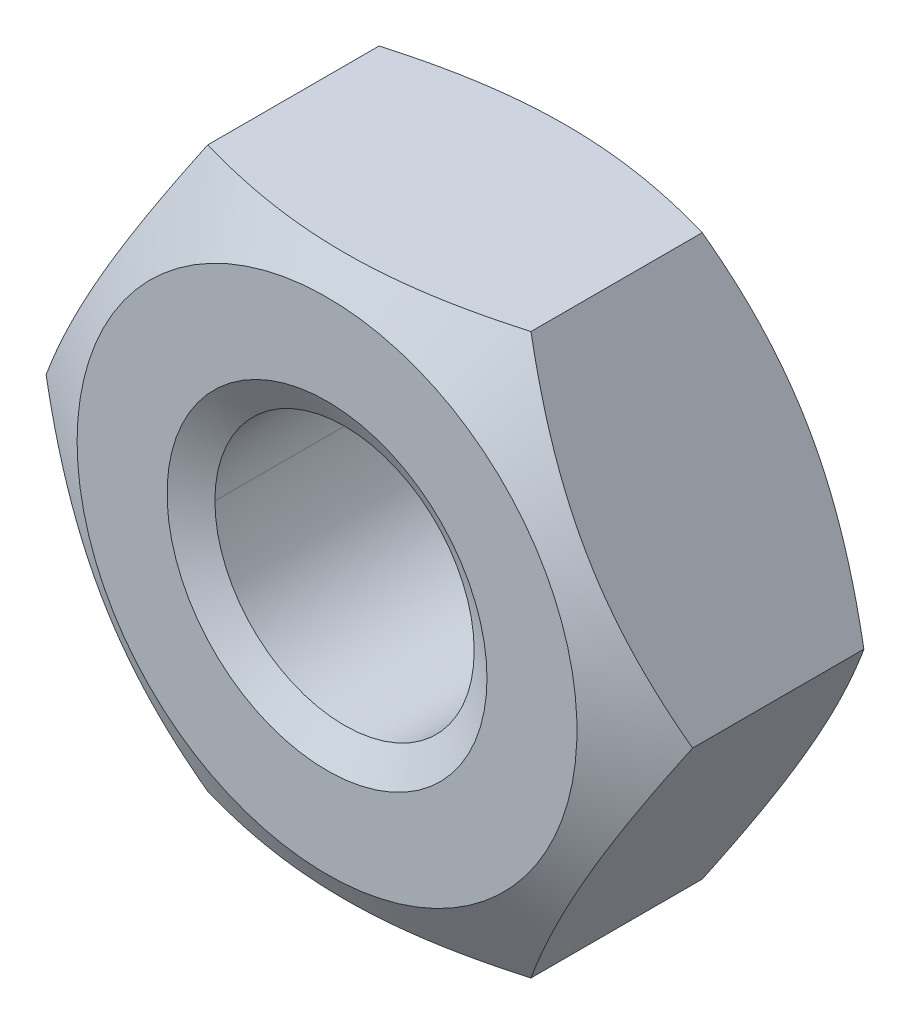
ISO-10303-21;
HEADER;
FILE_DESCRIPTION(('STEP AP214'),'2;1');
FILE_NAME('part.step','',(''),(''),'','','');
FILE_SCHEMA(('AUTOMOTIVE_DESIGN { 1 0 10303 214 1 1 1 1 }'));
ENDSEC;
DATA;
#1=APPLICATION_CONTEXT('core data for automotive mechanical design processes');
#2=APPLICATION_PROTOCOL_DEFINITION('international standard','automotive_design',2000,#1);
#3=PRODUCT_CONTEXT('',#1,'mechanical');
#4=PRODUCT('Part','Part','',(#3));
#5=PRODUCT_RELATED_PRODUCT_CATEGORY('part','',(#4));
#6=PRODUCT_DEFINITION_FORMATION('','',#4);
#7=PRODUCT_DEFINITION_CONTEXT('part definition',#1,'design');
#8=PRODUCT_DEFINITION('design','',#6,#7);
#9=PRODUCT_DEFINITION_SHAPE('','',#8);
#10=(LENGTH_UNIT() NAMED_UNIT(*) SI_UNIT(.MILLI.,.METRE.));
#11=(NAMED_UNIT(*) PLANE_ANGLE_UNIT() SI_UNIT($,.RADIAN.));
#12=(NAMED_UNIT(*) SI_UNIT($,.STERADIAN.) SOLID_ANGLE_UNIT());
#13=UNCERTAINTY_MEASURE_WITH_UNIT(LENGTH_MEASURE(1.E-05),#10,'distance_accuracy_value','');
#14=(GEOMETRIC_REPRESENTATION_CONTEXT(3) GLOBAL_UNCERTAINTY_ASSIGNED_CONTEXT((#13)) GLOBAL_UNIT_ASSIGNED_CONTEXT((#10,
#11,#12)) REPRESENTATION_CONTEXT('',''));
#15=CARTESIAN_POINT('',(0.,0.,0.));
#16=DIRECTION('',(0.,0.,1.));
#17=DIRECTION('',(1.,0.,0.));
#18=AXIS2_PLACEMENT_3D('',#15,#16,#17);
#19=CARTESIAN_POINT('',(3.125,0.,-3.2));
#20=CARTESIAN_POINT('',(4.046950596,0.,-2.667711575));
#21=(BOUNDED_CURVE() B_SPLINE_CURVE(1,(#19,#20),.UNSPECIFIED.,.F.,
.F.) B_SPLINE_CURVE_WITH_KNOTS((2,2),(0.,1.),
.UNSPECIFIED.) CURVE() GEOMETRIC_REPRESENTATION_ITEM() RATIONAL_B_SPLINE_CURVE((1.,1.)) REPRESENTATION_ITEM(''));
#22=CARTESIAN_POINT('',(0.,0.,-1002.670886258));
#23=DIRECTION('',(0.,0.,1.));
#24=AXIS1_PLACEMENT('',#22,#23);
#25=SURFACE_OF_REVOLUTION('',#21,#24);
#26=CARTESIAN_POINT('',(0.,0.,-3.19999999999998));
#27=DIRECTION('',(0.,0.,1.));
#28=DIRECTION('',(1.,0.,0.));
#29=AXIS2_PLACEMENT_3D('',#26,#27,#28);
#30=CIRCLE('',#29,3.125);
#31=CARTESIAN_POINT('',(3.125,0.,-3.19999999999998));
#32=VERTEX_POINT('',#31);
#33=EDGE_CURVE('E21',#32,#32,#30,.T.);
#34=ORIENTED_EDGE('',*,*,#33,.T.);
#35=EDGE_LOOP('',(#34));
#36=FACE_BOUND('',#35,.T.);
#37=CARTESIAN_POINT('',(4.04145188413461,-2.33162747523437E-10,-2.67088625777699));
#38=CARTESIAN_POINT('',(3.99877357058758,0.0739210072176439,-2.69552457184543));
#39=CARTESIAN_POINT('',(3.95593578246525,0.148118232735405,-2.71908817169469));
#40=CARTESIAN_POINT('',(3.86994379872142,0.297060717635427,-2.76377275939794));
#41=CARTESIAN_POINT('',(3.82678960461288,0.371805974397152,-2.7848937589237));
#42=CARTESIAN_POINT('',(3.7400916177546,0.521971292561794,-2.82443455729776));
#43=CARTESIAN_POINT('',(3.69654727796061,0.597392301473136,-2.84284959447192));
#44=CARTESIAN_POINT('',(3.60915344918995,0.748762853184163,-2.87663490486331));
#45=CARTESIAN_POINT('',(3.56530389267778,0.824712512958749,-2.89200448050794));
#46=CARTESIAN_POINT('',(3.46255186656079,1.00268424278845,-2.92400775933121));
#47=CARTESIAN_POINT('',(3.40354502078712,1.1048870976711,-2.93932918292204));
#48=CARTESIAN_POINT('',(3.28518051668262,1.30990043260939,-2.96341281398515));
#49=CARTESIAN_POINT('',(3.22582277927777,1.41271104962525,-2.97217348139595));
#50=CARTESIAN_POINT('',(3.10695837795692,1.6185902319409,-2.98275263016002));
#51=CARTESIAN_POINT('',(3.04745173506135,1.72165876083223,-2.98457204154372));
#52=CARTESIAN_POINT('',(2.92849176169356,1.92770347878898,-2.98118876153224));
#53=CARTESIAN_POINT('',(2.86903842891754,2.03067967184468,-2.97598638982451));
#54=CARTESIAN_POINT('',(2.75037346934866,2.23621341091275,-2.95879077651094));
#55=CARTESIAN_POINT('',(2.69116187629247,2.33877089849149,-2.94679661763094));
#56=CARTESIAN_POINT('',(2.57315943945173,2.54315711453309,-2.91651289065987));
#57=CARTESIAN_POINT('',(2.51436850392147,2.64498600190421,-2.89822474083771));
#58=CARTESIAN_POINT('',(2.41910247799915,2.80999159905023,-2.86387447767375));
#59=CARTESIAN_POINT('',(2.38246995171623,2.87344099578704,-2.84951949082425));
#60=CARTESIAN_POINT('',(2.30942945459413,2.99995084782288,-2.81877177577183));
#61=CARTESIAN_POINT('',(2.27302142547432,3.06301140406693,-2.8023796020147));
#62=CARTESIAN_POINT('',(2.20050533663991,3.18861295430447,-2.76776978935778));
#63=CARTESIAN_POINT('',(2.16439680628469,3.25115476347142,-2.74955607254622));
#64=CARTESIAN_POINT('',(2.09239707075473,3.37586196355094,-2.71144262747335));
#65=CARTESIAN_POINT('',(2.05650589714822,3.43802729978573,-2.69154266031372));
#66=CARTESIAN_POINT('',(2.02072594214933,3.49999999974135,-2.67088625779916));
#67=B_SPLINE_CURVE_WITH_KNOTS('',3,(#37,#38,#39,#40,#41,#42,#43,#44,#45,#46,#47,#48,#49,#50,#51,
#52,#53,#54,#55,#56,#57,#58,#59,#60,#61,#62,#63,#64,#65,#66),.UNSPECIFIED.,.F.,.F.,(4,2,2,2,2,2,
2,2,2,2,2,2,2,2,4),(0.,0.266529606521013,0.533057939400367,0.800049804791546,1.06710275499963,
1.42394036053395,1.78086170332719,2.13773522201312,2.49459249352507,2.85149797238619,
3.20832307984495,3.43227059844916,3.65615729987856,3.87957191030522,4.10301822592827),.UNSPECIFIED.);
#68=CARTESIAN_POINT('',(4.04145188406731,-1.16581373761719E-10,-2.67088625781585));
#69=VERTEX_POINT('',#68);
#70=CARTESIAN_POINT('',(2.02072594217483,3.49999999987068,-2.67088625772714));
#71=VERTEX_POINT('',#70);
#72=EDGE_CURVE('E292',#69,#71,#67,.T.);
#73=ORIENTED_EDGE('',*,*,#72,.F.);
#74=CARTESIAN_POINT('',(2.02072594205263,-3.49999999990884,-2.67088625774333));
#75=CARTESIAN_POINT('',(2.06340425559948,-3.42607899245835,-2.69552457181276));
#76=CARTESIAN_POINT('',(2.10624204372164,-3.3518817669409,-2.71908817166304));
#77=CARTESIAN_POINT('',(2.19223402746511,-3.2029392820415,-2.76377275936847));
#78=CARTESIAN_POINT('',(2.23538822157347,-3.12819402528008,-2.78489375889538));
#79=CARTESIAN_POINT('',(2.32208620843144,-2.97802870711597,-2.82443455727194));
#80=CARTESIAN_POINT('',(2.3656305482253,-2.90260769820485,-2.84284959444744));
#81=CARTESIAN_POINT('',(2.45302437699573,-2.75123714649423,-2.87663490484162));
#82=CARTESIAN_POINT('',(2.49687393350778,-2.67528748671984,-2.89200448048771));
#83=CARTESIAN_POINT('',(2.59962595962554,-2.49731575688883,-2.92400775931484));
#84=CARTESIAN_POINT('',(2.65863280540009,-2.39511290200465,-2.93932918290803));
#85=CARTESIAN_POINT('',(2.77699730950641,-2.1900995670632,-2.96341281397579));
#86=CARTESIAN_POINT('',(2.8363550469122,-2.0872889500457,-2.97217348138888));
#87=CARTESIAN_POINT('',(2.95521944823501,-1.88140976772666,-2.98275263015736));
#88=CARTESIAN_POINT('',(3.0147260911316,-1.77834123883357,-2.98457204154318));
#89=CARTESIAN_POINT('',(3.13368606450141,-1.57229652087331,-2.98118876153571));
#90=CARTESIAN_POINT('',(3.19313939727844,-1.46932032781586,-2.97598638982985));
#91=CARTESIAN_POINT('',(3.3118043568494,-1.2637865887442,-2.95879077651969));
#92=CARTESIAN_POINT('',(3.37101594990666,-1.16122910116365,-2.94679661764123));
#93=CARTESIAN_POINT('',(3.48901838674949,-0.956842885118333,-2.91651289067288));
#94=CARTESIAN_POINT('',(3.54780932228077,-0.855013997745325,-2.8982247408519));
#95=CARTESIAN_POINT('',(3.64307534819865,-0.690008400607049,-2.86387447769181));
#96=CARTESIAN_POINT('',(3.67970787447611,-0.626559003879795,-2.84951949084548));
#97=CARTESIAN_POINT('',(3.75274837158731,-0.500049151862902,-2.81877177579994));
#98=CARTESIAN_POINT('',(3.78915640070168,-0.436988595628246,-2.80237960204652));
#99=CARTESIAN_POINT('',(3.86167248952533,-0.311387045409312,-2.76776978939745));
#100=CARTESIAN_POINT('',(3.89778101987524,-0.248845236251567,-2.74955607259004));
#101=CARTESIAN_POINT('',(3.96978075539463,-0.124138036190356,-2.7114426275258));
#102=CARTESIAN_POINT('',(4.0056719289959,-0.0619726999646561,-2.69154266037066));
#103=CARTESIAN_POINT('',(4.04145188398957,-1.80732642589287E-11,-2.67088625786073));
#104=B_SPLINE_CURVE_WITH_KNOTS('',3,(#74,#75,#76,#77,#78,#79,#80,#81,#82,#83,#84,#85,#86,#87,
#88,#89,#90,#91,#92,#93,#94,#95,#96,#97,#98,#99,#100,#101,#102,#103),.UNSPECIFIED.,.F.,.F.,(4,2,
2,2,2,2,2,2,2,2,2,2,2,2,4),(0.,0.266529606520799,0.533057939399931,0.800049804791203,
1.06710275499939,1.42394036053987,1.78086170333927,2.13773522203136,2.49459249354913,
2.85149797241608,3.20832307988064,3.43227059845063,3.65615729984582,3.87957191023852,
4.10301822582762),.UNSPECIFIED.);
#105=CARTESIAN_POINT('',(2.02072594202978,-3.49999999995442,-2.67088625772714));
#106=VERTEX_POINT('',#105);
#107=EDGE_CURVE('E611',#106,#69,#104,.T.);
#108=ORIENTED_EDGE('',*,*,#107,.F.);
#109=CARTESIAN_POINT('',(-2.02072594175857,-3.5,-2.67088625778264));
#110=CARTESIAN_POINT('',(-1.93536931465794,-3.5,-2.69552457184677));
#111=CARTESIAN_POINT('',(-1.8496937384067,-3.5,-2.71908817169155));
#112=CARTESIAN_POINT('',(-1.67770977090589,-3.5,-2.76377275938547));
#113=CARTESIAN_POINT('',(-1.59140138268224,-3.5,-2.78489375890636));
#114=CARTESIAN_POINT('',(-1.41800540895268,-3.5,-2.82443455727018));
#115=CARTESIAN_POINT('',(-1.33091672935828,-3.5,-2.84284959443896));
#116=CARTESIAN_POINT('',(-1.15612907180422,-3.5,-2.87663490481927));
#117=CARTESIAN_POINT('',(-1.06842995877358,-3.5,-2.8920044804582));
#118=CARTESIAN_POINT('',(-0.862925906525141,-3.5,-2.92400775926783));
#119=CARTESIAN_POINT('',(-0.744912214969743,-3.5,-2.93932918285064));
#120=CARTESIAN_POINT('',(-0.508183206745008,-3.5,-2.96341281389737));
#121=CARTESIAN_POINT('',(-0.38946773192762,-3.5,-2.97217348129983));
#122=CARTESIAN_POINT('',(-0.151738929271011,-3.5,-2.98275263004747));
#123=CARTESIAN_POINT('',(-0.0327256434726541,-3.5,-2.98457204142309));
#124=CARTESIAN_POINT('',(0.205194303276983,-3.5,-2.98118876139594));
#125=CARTESIAN_POINT('',(0.324100968835836,-3.5,-2.9759863896806));
#126=CARTESIAN_POINT('',(0.561430887986871,-3.5,-2.95879077635265));
#127=CARTESIAN_POINT('',(0.679854074105688,-3.50000000000001,-2.94679661746586));
#128=CARTESIAN_POINT('',(0.915858947799708,-3.49999999999999,-2.9165128904822));
#129=CARTESIAN_POINT('',(1.03344081886635,-3.49999999999996,-2.89822474065424));
#130=CARTESIAN_POINT('',(1.22397287068206,-3.49999999999997,-2.86387447748869));
#131=CARTESIAN_POINT('',(1.2972379232131,-3.49999999999999,-2.84951949064425));
#132=CARTESIAN_POINT('',(1.44331891738807,-3.50000000000001,-2.81877177560441));
#133=CARTESIAN_POINT('',(1.51613497559328,-3.5,-2.80237960185479));
#134=CARTESIAN_POINT('',(1.66116715319376,-3.5,-2.76776978921505));
#135=CARTESIAN_POINT('',(1.73338421387027,-3.5,-2.74955607241315));
#136=CARTESIAN_POINT('',(1.8773836848628,-3.5,-2.71144262736142));
#137=CARTESIAN_POINT('',(1.94916603204238,-3.5,-2.69154266021327));
#138=CARTESIAN_POINT('',(2.02072594200693,-3.5,-2.67088625771095));
#139=B_SPLINE_CURVE_WITH_KNOTS('',3,(#109,#110,#111,#112,#113,#114,#115,#116,#117,#118,#119,
#120,#121,#122,#123,#124,#125,#126,#127,#128,#129,#130,#131,#132,#133,#134,#135,#136,#137,#138),
.UNSPECIFIED.,.F.,.F.,(4,2,2,2,2,2,2,2,2,2,2,2,2,2,4),(0.,0.266529606521398,0.53305793940116,
0.800049804792306,1.06710275500034,1.42394036053419,1.78086170332701,2.13773522201256,
2.49459249352436,2.85149797238529,3.20832307984386,3.4322705983295,3.65615729964037,
3.87957190994852,4.10301822545308),.UNSPECIFIED.);
#140=CARTESIAN_POINT('',(-2.02072594184351,-3.50000000006196,-2.67088625772714));
#141=VERTEX_POINT('',#140);
#142=EDGE_CURVE('E105',#141,#106,#139,.T.);
#143=ORIENTED_EDGE('',*,*,#142,.F.);
#144=CARTESIAN_POINT('',(-4.04145188373077,-4.6632069187363E-10,-2.67088625801015));
#145=CARTESIAN_POINT('',(-3.99877357018257,-0.073921007919146,-2.69552457207179));
#146=CARTESIAN_POINT('',(-3.95593578205906,-0.148118233438942,-2.71908817191388));
#147=CARTESIAN_POINT('',(-3.86994379831287,-0.297060718343048,-2.76377275960192));
#148=CARTESIAN_POINT('',(-3.82678960420315,-0.371805975106823,-2.78489375911963));
#149=CARTESIAN_POINT('',(-3.74009161734275,-0.52197129327514,-2.82443455747645));
#150=CARTESIAN_POINT('',(-3.69654727754783,-0.597392302188103,-2.84284959464142));
#151=CARTESIAN_POINT('',(-3.60915344877539,-0.748762853902206,-2.87663490501355));
#152=CARTESIAN_POINT('',(-3.56530389226238,-0.824712513678245,-2.89200448064812));
#153=CARTESIAN_POINT('',(-3.46255186615046,-1.00268424349916,-2.92400775944461));
#154=CARTESIAN_POINT('',(-3.40354502038281,-1.10488709837138,-2.93932918301906));
#155=CARTESIAN_POINT('',(-3.28518051629079,-1.30990043328806,-2.96341281404996));
#156=CARTESIAN_POINT('',(-3.2258227788924,-1.41271105029274,-2.97217348144494));
#157=CARTESIAN_POINT('',(-3.1069583775849,-1.61859023258526,-2.98275263017837));
#158=CARTESIAN_POINT('',(-3.04745173469624,-1.72165876146463,-2.98457204154726));
#159=CARTESIAN_POINT('',(-2.92849176134246,-1.92770347939711,-2.98118876150818));
#160=CARTESIAN_POINT('',(-2.86903842857356,-2.03067967244048,-2.97598638978762));
#161=CARTESIAN_POINT('',(-2.7503734690192,-2.23621341148338,-2.95879077645041));
#162=CARTESIAN_POINT('',(-2.69116187597044,-2.33877089904926,-2.94679661755958));
#163=CARTESIAN_POINT('',(-2.57315943914466,-2.54315711506495,-2.9165128905696));
#164=CARTESIAN_POINT('',(-2.51436850362193,-2.64498600242301,-2.89822474073936));
#165=CARTESIAN_POINT('',(-2.41910247771312,-2.80999159954565,-2.86387447756455));
#166=CARTESIAN_POINT('',(-2.38246995143615,-2.87344099627214,-2.84951949071166));
#167=CARTESIAN_POINT('',(-2.30942945432591,-2.99995084828745,-2.81877177565359));
#168=CARTESIAN_POINT('',(-2.273021425212,-3.06301140452127,-2.80237960189421));
#169=CARTESIAN_POINT('',(-2.20050533638947,-3.18861295473825,-2.76776978923371));
#170=CARTESIAN_POINT('',(-2.16439680604021,-3.25115476389487,-2.74955607242082));
#171=CARTESIAN_POINT('',(-2.09239707052212,-3.37586196395384,-2.7114426273462));
#172=CARTESIAN_POINT('',(-2.0565058969215,-3.43802730017843,-2.69154266018614));
#173=CARTESIAN_POINT('',(-2.02072594192845,-3.50000000012393,-2.67088625767164));
#174=B_SPLINE_CURVE_WITH_KNOTS('',3,(#144,#145,#146,#147,#148,#149,#150,#151,#152,#153,#154,
#155,#156,#157,#158,#159,#160,#161,#162,#163,#164,#165,#166,#167,#168,#169,#170,#171,#172,#173),
.UNSPECIFIED.,.F.,.F.,(4,2,2,2,2,2,2,2,2,2,2,2,2,2,4),(0.,0.266529606522078,0.533057939402568,
0.80004980479351,1.06710275500131,1.42394036049347,1.78086170324462,2.13773522188852,
2.49459249335961,2.85149797217981,3.20832307959772,3.43227059816885,3.65615729956521,
3.87957190995814,4.10301822554748),.UNSPECIFIED.);
#175=CARTESIAN_POINT('',(-4.04145188352143,-8.28915515419085E-10,-2.67088625815698));
#176=VERTEX_POINT('',#175);
#177=EDGE_CURVE('E96',#176,#141,#174,.T.);
#178=ORIENTED_EDGE('',*,*,#177,.F.);
#179=CARTESIAN_POINT('',(-2.02072594183175,3.50000000029142,-2.67088625761581));
#180=CARTESIAN_POINT('',(-2.06340425537803,3.42607899284192,-2.69552457168902));
#181=CARTESIAN_POINT('',(-2.10624204349961,3.35188176732546,-2.71908817154323));
#182=CARTESIAN_POINT('',(-2.19223402724194,3.20293928242805,-2.76377275925699));
#183=CARTESIAN_POINT('',(-2.23538822134971,3.12819402566763,-2.7848937587883));
#184=CARTESIAN_POINT('',(-2.32208620820652,2.97802870750554,-2.82443455717431));
#185=CARTESIAN_POINT('',(-2.3656305479998,2.90260769859543,-2.84284959435487));
#186=CARTESIAN_POINT('',(-2.45302437676912,2.75123714688674,-2.87663490475955));
#187=CARTESIAN_POINT('',(-2.49687393328065,2.67528748711325,-2.89200448041108));
#188=CARTESIAN_POINT('',(-2.59962595940102,2.49731575727771,-2.92400775925278));
#189=CARTESIAN_POINT('',(-2.65863280517876,2.39511290238799,-2.93932918285494));
#190=CARTESIAN_POINT('',(-2.77699730929171,2.19009956743506,-2.96341281394028));
#191=CARTESIAN_POINT('',(-2.83635504670094,2.08728895041162,-2.97217348136198));
#192=CARTESIAN_POINT('',(-2.95521944803085,1.88140976808027,-2.98275263014725));
#193=CARTESIAN_POINT('',(-3.01472609093111,1.77834123918083,-2.98457204154124));
#194=CARTESIAN_POINT('',(-3.13368606430858,1.57229652120731,-2.98118876154896));
#195=CARTESIAN_POINT('',(-3.19313939708958,1.46932032814297,-2.97598638985012));
#196=CARTESIAN_POINT('',(-3.31180435666868,1.26378658905722,-2.95879077655286));
#197=CARTESIAN_POINT('',(-3.37101594973009,1.16122910146948,-2.94679661768028));
#198=CARTESIAN_POINT('',(-3.48901838658131,0.95684288540963,-2.91651289072225));
#199=CARTESIAN_POINT('',(-3.54780932211683,0.855013998029283,-2.89822474090573));
#200=CARTESIAN_POINT('',(-3.6430753480871,0.690008400800269,-2.86387447773536));
#201=CARTESIAN_POINT('',(-3.67970787441245,0.626559003990061,-2.84951949087198));
#202=CARTESIAN_POINT('',(-3.75274837161886,0.500049151808244,-2.81877177578703));
#203=CARTESIAN_POINT('',(-3.78915640078056,0.436988595491618,-2.80237960201126));
#204=CARTESIAN_POINT('',(-3.86167248969814,0.311387045109993,-2.76776978931276));
#205=CARTESIAN_POINT('',(-3.89778102009466,0.248845235871526,-2.74955607247828));
#206=CARTESIAN_POINT('',(-3.96978075570668,0.124138035649868,-2.71144262735603));
#207=CARTESIAN_POINT('',(-4.00567192935398,0.0619726993444434,-2.69154266016995));
#208=CARTESIAN_POINT('',(-4.04145188439341,-6.81409024846783E-10,-2.67088625762757));
#209=B_SPLINE_CURVE_WITH_KNOTS('',3,(#179,#180,#181,#182,#183,#184,#185,#186,#187,#188,#189,
#190,#191,#192,#193,#194,#195,#196,#197,#198,#199,#200,#201,#202,#203,#204,#205,#206,#207,#208),
.UNSPECIFIED.,.F.,.F.,(4,2,2,2,2,2,2,2,2,2,2,2,2,2,4),(0.,0.266529606520633,0.533057939399554,
0.800049804790539,1.06710275499847,1.42394036056143,1.78086170338327,2.13773522209772,
2.49459249363838,2.85149797252827,3.20832308001585,3.43227059887756,3.65615730056439,
3.87957191124802,4.10301822712797),.UNSPECIFIED.);
#210=CARTESIAN_POINT('',(-2.02072594169846,3.50000000014571,-2.67088625772714));
#211=VERTEX_POINT('',#210);
#212=EDGE_CURVE('E82',#211,#176,#209,.T.);
#213=ORIENTED_EDGE('',*,*,#212,.F.);
#214=CARTESIAN_POINT('',(2.02072594220033,3.5,-2.67088625765512));
#215=CARTESIAN_POINT('',(1.935369315101,3.5,-2.69552457172295));
#216=CARTESIAN_POINT('',(1.84969373885107,3.5,-2.71908817157163));
#217=CARTESIAN_POINT('',(1.67770977135287,3.5,-2.76377275927383));
#218=CARTESIAN_POINT('',(1.59140138313054,3.5,-2.7848937587991));
#219=CARTESIAN_POINT('',(1.41800540940331,3.5,-2.82443455717236));
#220=CARTESIAN_POINT('',(1.33091672980991,3.5,-2.84284959434619));
#221=CARTESIAN_POINT('',(1.15612907225775,3.5,-2.87663490473708));
#222=CARTESIAN_POINT('',(1.068429959228,3.5,-2.89200448038154));
#223=CARTESIAN_POINT('',(0.862925906973952,3.5,-2.9240077592058));
#224=CARTESIAN_POINT('',(0.744912215411926,3.5,-2.93932918279751));
#225=CARTESIAN_POINT('',(0.50818320717347,3.5,-2.96341281386183));
#226=CARTESIAN_POINT('',(0.389467732348988,3.5,-2.97217348127298));
#227=CARTESIAN_POINT('',(0.151738929677694,3.5,-2.98275263003741));
#228=CARTESIAN_POINT('',(0.032725643871744,3.5,-2.98457204142112));
#229=CARTESIAN_POINT('',(-0.20519430289323,3.5,-2.98118876140906));
#230=CARTESIAN_POINT('',(-0.324100968459829,3.5,-2.97598638970073));
#231=CARTESIAN_POINT('',(-0.561430887626686,3.5,-2.95879077638567));
#232=CARTESIAN_POINT('',(-0.679854073753578,3.50000000000001,-2.94679661750477));
#233=CARTESIAN_POINT('',(-0.91585894746389,3.49999999999999,-2.9165128905315));
#234=CARTESIAN_POINT('',(-1.03344081853875,3.49999999999996,-2.89822474070805));
#235=CARTESIAN_POINT('',(-1.22397287035205,3.49999999999997,-2.86387447755149));
#236=CARTESIAN_POINT('',(-1.29723792287256,3.49999999999999,-2.84951949071246));
#237=CARTESIAN_POINT('',(-1.44331891702666,3.50000000000001,-2.81877177568384));
#238=CARTESIAN_POINT('',(-1.51613497522153,3.5,-2.80237960194004));
#239=CARTESIAN_POINT('',(-1.66116715280163,3.5,-2.76776978931207));
#240=CARTESIAN_POINT('',(-1.73338421346812,3.5,-2.74955607251613));
#241=CARTESIAN_POINT('',(-1.87738368444074,3.5,-2.71144262747651));
#242=CARTESIAN_POINT('',(-1.94916603161043,3.5,-2.69154266033452));
#243=CARTESIAN_POINT('',(-2.02072594156517,3.5,-2.67088625783847));
#244=B_SPLINE_CURVE_WITH_KNOTS('',3,(#214,#215,#216,#217,#218,#219,#220,#221,#222,#223,#224,
#225,#226,#227,#228,#229,#230,#231,#232,#233,#234,#235,#236,#237,#238,#239,#240,#241,#242,#243),
.UNSPECIFIED.,.F.,.F.,(4,2,2,2,2,2,2,2,2,2,2,2,2,2,4),(0.,0.266529606520733,0.533057939399795,
0.800049804791151,1.06710275499942,1.42394036055643,1.78086170337238,2.13773522208103,
2.49459249361507,2.85149797249828,3.20832307997905,3.43227059843059,3.65615729970736,
3.87957190998198,4.10301822545303),.UNSPECIFIED.);
#245=EDGE_CURVE('E93',#71,#211,#244,.T.);
#246=ORIENTED_EDGE('',*,*,#245,.F.);
#247=EDGE_LOOP('',(#73,#108,#143,#178,#213,#246));
#248=FACE_BOUND('',#247,.T.);
#249=ADVANCED_FACE('F17',(#36,#248),#25,.T.);
#250=CARTESIAN_POINT('',(-3.1625,-3.1625,-3.2));
#251=DIRECTION('',(0.,0.,1.));
#252=DIRECTION('',(1.,0.,0.));
#253=AXIS2_PLACEMENT_3D('',#250,#251,#252);
#254=PLANE('',#253);
#255=CARTESIAN_POINT('',(0.,0.,-3.19999999999998));
#256=DIRECTION('',(0.,0.,-1.));
#257=DIRECTION('',(-1.,0.,0.));
#258=AXIS2_PLACEMENT_3D('',#255,#256,#257);
#259=CIRCLE('',#258,1.839815752);
#260=CARTESIAN_POINT('',(-1.839815752,0.,-3.19999999999998));
#261=VERTEX_POINT('',#260);
#262=EDGE_CURVE('E253',#261,#261,#259,.T.);
#263=ORIENTED_EDGE('',*,*,#262,.F.);
#264=EDGE_LOOP('',(#263));
#265=FACE_BOUND('',#264,.T.);
#266=ORIENTED_EDGE('',*,*,#33,.F.);
#267=EDGE_LOOP('',(#266));
#268=FACE_BOUND('',#267,.T.);
#269=ADVANCED_FACE('F275',(#265,#268),#254,.F.);
#270=CARTESIAN_POINT('',(-2.020725942,3.5,-3.015826291));
#271=DIRECTION('',(-0.866025403801977,0.499999999969623,0.));
#272=DIRECTION('',(-0.499999999969623,-0.866025403801977,0.));
#273=AXIS2_PLACEMENT_3D('',#270,#271,#272);
#274=PLANE('',#273);
#275=ORIENTED_EDGE('',*,*,#212,.T.);
#276=DIRECTION('',(0.,0.,1.));
#277=VECTOR('',#276,1.);
#278=CARTESIAN_POINT('',(-4.041451884,0.,-3.015826291));
#279=LINE('',#278,#277);
#280=CARTESIAN_POINT('',(-4.04145188406731,-1.16581302226748E-10,-0.529113742158184));
#281=VERTEX_POINT('',#280);
#282=EDGE_CURVE('E86',#281,#176,#279,.F.);
#283=ORIENTED_EDGE('',*,*,#282,.F.);
#284=CARTESIAN_POINT('',(-4.04145188413462,-2.33162468928224E-10,-0.529113742223013));
#285=CARTESIAN_POINT('',(-3.99877357058758,0.0739210072176436,-0.504475428154571));
#286=CARTESIAN_POINT('',(-3.95593578246525,0.148118232735405,-0.480911828305313));
#287=CARTESIAN_POINT('',(-3.86994379872142,0.297060717635426,-0.436227240602059));
#288=CARTESIAN_POINT('',(-3.82678960461288,0.371805974397151,-0.415106241076304));
#289=CARTESIAN_POINT('',(-3.7400916177546,0.521971292561793,-0.375565442702239));
#290=CARTESIAN_POINT('',(-3.69654727796061,0.597392301473135,-0.357150405528083));
#291=CARTESIAN_POINT('',(-3.60915344918995,0.748762853184162,-0.323365095136695));
#292=CARTESIAN_POINT('',(-3.56530389267778,0.824712512958747,-0.307995519492059));
#293=CARTESIAN_POINT('',(-3.46255186656079,1.00268424278845,-0.275992240668787));
#294=CARTESIAN_POINT('',(-3.40354502078712,1.1048870976711,-0.260670817077955));
#295=CARTESIAN_POINT('',(-3.28518051668263,1.30990043260939,-0.236587186014853));
#296=CARTESIAN_POINT('',(-3.22582277927778,1.41271104962525,-0.227826518604053));
#297=CARTESIAN_POINT('',(-3.10695837795692,1.6185902319409,-0.217247369839994));
#298=CARTESIAN_POINT('',(-3.04745173506135,1.72165876083223,-0.215427958456297));
#299=CARTESIAN_POINT('',(-2.92849176169356,1.92770347878898,-0.218811238467769));
#300=CARTESIAN_POINT('',(-2.86903842891754,2.03067967184468,-0.224013610175502));
#301=CARTESIAN_POINT('',(-2.75037346934866,2.23621341091275,-0.241209223489042));
#302=CARTESIAN_POINT('',(-2.69116187629247,2.33877089849149,-0.253203382369018));
#303=CARTESIAN_POINT('',(-2.57315943945173,2.54315711453309,-0.283487109340101));
#304=CARTESIAN_POINT('',(-2.51436850392147,2.6449860019042,-0.301775259162291));
#305=CARTESIAN_POINT('',(-2.41910247799915,2.80999159905023,-0.336125522326251));
#306=CARTESIAN_POINT('',(-2.38246995171623,2.87344099578704,-0.350480509175738));
#307=CARTESIAN_POINT('',(-2.30942945459413,2.99995084782288,-0.381228224228154));
#308=CARTESIAN_POINT('',(-2.27302142547432,3.06301140406693,-0.39762039798529));
#309=CARTESIAN_POINT('',(-2.20050533663991,3.18861295430447,-0.432230210642214));
#310=CARTESIAN_POINT('',(-2.16439680628469,3.25115476347143,-0.450443927453767));
#311=CARTESIAN_POINT('',(-2.09239707075473,3.37586196355094,-0.488557372526637));
#312=CARTESIAN_POINT('',(-2.05650589714822,3.43802729978573,-0.50845733968627));
#313=CARTESIAN_POINT('',(-2.02072594214933,3.49999999974135,-0.529113742200837));
#314=B_SPLINE_CURVE_WITH_KNOTS('',3,(#284,#285,#286,#287,#288,#289,#290,#291,#292,#293,#294,
#295,#296,#297,#298,#299,#300,#301,#302,#303,#304,#305,#306,#307,#308,#309,#310,#311,#312,#313),
.UNSPECIFIED.,.F.,.F.,(4,2,2,2,2,2,2,2,2,2,2,2,2,2,4),(0.,0.266529606521013,0.533057939400367,
0.800049804791546,1.06710275499963,1.42394036053395,1.78086170332719,2.13773522201312,
2.49459249352507,2.85149797238619,3.20832307984495,3.43227059844916,3.65615729987856,
3.87957191030523,4.10301822592828),.UNSPECIFIED.);
#315=CARTESIAN_POINT('',(-2.02072594210016,3.5,-0.529113741927586));
#316=VERTEX_POINT('',#315);
#317=EDGE_CURVE('E257',#281,#316,#314,.T.);
#318=ORIENTED_EDGE('',*,*,#317,.T.);
#319=DIRECTION('',(0.,0.,1.));
#320=VECTOR('',#319,1.);
#321=CARTESIAN_POINT('',(-2.020725942,3.5,-3.037384162));
#322=LINE('',#321,#320);
#323=EDGE_CURVE('E88',#211,#316,#322,.T.);
#324=ORIENTED_EDGE('',*,*,#323,.F.);
#325=EDGE_LOOP('',(#275,#283,#318,#324));
#326=FACE_BOUND('',#325,.T.);
#327=ADVANCED_FACE('F84',(#326),#274,.T.);
#328=CARTESIAN_POINT('',(-2.020725942,3.5,-3.037384162));
#329=DIRECTION('',(0.,1.,0.));
#330=DIRECTION('',(0.,0.,1.));
#331=AXIS2_PLACEMENT_3D('',#328,#329,#330);
#332=PLANE('',#331);
#333=ORIENTED_EDGE('',*,*,#245,.T.);
#334=ORIENTED_EDGE('',*,*,#323,.T.);
#335=CARTESIAN_POINT('',(-2.02072594220033,3.5,-0.529113742344882));
#336=CARTESIAN_POINT('',(-1.93536931510098,3.5,-0.504475428277104));
#337=CARTESIAN_POINT('',(-1.84969373885105,3.5,-0.480911828428431));
#338=CARTESIAN_POINT('',(-1.67770977135286,3.5,-0.436227240726216));
#339=CARTESIAN_POINT('',(-1.59140138313054,3.5,-0.415106241200915));
#340=CARTESIAN_POINT('',(-1.41800540940331,3.5,-0.375565442827623));
#341=CARTESIAN_POINT('',(-1.33091672980991,3.5,-0.35715040565379));
#342=CARTESIAN_POINT('',(-1.15612907225775,3.5,-0.323365095262906));
#343=CARTESIAN_POINT('',(-1.068429959228,3.5,-0.30799551961845));
#344=CARTESIAN_POINT('',(-0.862925906973949,3.5,-0.275992240794205));
#345=CARTESIAN_POINT('',(-0.744912215411922,3.5,-0.260670817202516));
#346=CARTESIAN_POINT('',(-0.50818320717347,3.5,-0.236587186138122));
#347=CARTESIAN_POINT('',(-0.389467732348993,3.5,-0.227826518726888));
#348=CARTESIAN_POINT('',(-0.151738929677698,3.5,-0.217247369962449));
#349=CARTESIAN_POINT('',(-0.0327256438717428,3.5,-0.215427958578806));
#350=CARTESIAN_POINT('',(0.205194302893229,3.5,-0.218811238590987));
#351=CARTESIAN_POINT('',(0.324100968459819,3.5,-0.224013610299364));
#352=CARTESIAN_POINT('',(0.561430887626682,3.5,-0.24120922361434));
#353=CARTESIAN_POINT('',(0.679854073753589,3.50000000000001,-0.253203382495109));
#354=CARTESIAN_POINT('',(0.915858947463905,3.49999999999999,-0.283487109468354));
#355=CARTESIAN_POINT('',(1.03344081853875,3.49999999999996,-0.301775259291913));
#356=CARTESIAN_POINT('',(1.22397287035205,3.49999999999997,-0.336125522448536));
#357=CARTESIAN_POINT('',(1.29723792287256,3.49999999999999,-0.350480509287562));
#358=CARTESIAN_POINT('',(1.44331891702668,3.50000000000001,-0.381228224316114));
#359=CARTESIAN_POINT('',(1.51613497522156,3.5,-0.397620398059847));
#360=CARTESIAN_POINT('',(1.66116715280165,3.5,-0.432230210687864));
#361=CARTESIAN_POINT('',(1.73338421346811,3.5,-0.45044392748392));
#362=CARTESIAN_POINT('',(1.8773836844407,3.5,-0.48855737252366));
#363=CARTESIAN_POINT('',(1.94916603161038,3.5,-0.508457339665662));
#364=CARTESIAN_POINT('',(2.02072594156517,3.5,-0.529113742161528));
#365=B_SPLINE_CURVE_WITH_KNOTS('',3,(#335,#336,#337,#338,#339,#340,#341,#342,#343,#344,#345,
#346,#347,#348,#349,#350,#351,#352,#353,#354,#355,#356,#357,#358,#359,#360,#361,#362,#363,#364),
.UNSPECIFIED.,.F.,.F.,(4,2,2,2,2,2,2,2,2,2,2,2,2,2,4),(0.,0.266529606520733,0.533057939399794,
0.80004980479115,1.06710275499942,1.42394036055643,1.78086170337238,2.13773522208104,
2.49459249361508,2.85149797249828,3.20832307997907,3.43227059843061,3.65615729970738,
3.87957190998199,4.10301822545304),.UNSPECIFIED.);
#366=CARTESIAN_POINT('',(2.02072594191587,3.50000000014571,-0.529113742238773));
#367=VERTEX_POINT('',#366);
#368=EDGE_CURVE('E265',#316,#367,#365,.T.);
#369=ORIENTED_EDGE('',*,*,#368,.T.);
#370=DIRECTION('',(0.,0.,1.));
#371=VECTOR('',#370,1.);
#372=CARTESIAN_POINT('',(2.020725942,3.5,-3.015826291));
#373=LINE('',#372,#371);
#374=EDGE_CURVE('E299',#71,#367,#373,.T.);
#375=ORIENTED_EDGE('',*,*,#374,.F.);
#376=EDGE_LOOP('',(#333,#334,#369,#375));
#377=FACE_BOUND('',#376,.T.);
#378=ADVANCED_FACE('F274',(#377),#332,.T.);
#379=CARTESIAN_POINT('',(4.041451884,0.,-3.015826291));
#380=DIRECTION('',(0.866025403801977,0.499999999969623,0.));
#381=DIRECTION('',(-0.499999999969623,0.866025403801977,0.));
#382=AXIS2_PLACEMENT_3D('',#379,#380,#381);
#383=PLANE('',#382);
#384=ORIENTED_EDGE('',*,*,#72,.T.);
#385=ORIENTED_EDGE('',*,*,#374,.T.);
#386=CARTESIAN_POINT('',(2.02072594183175,3.50000000029142,-0.529113742384192));
#387=CARTESIAN_POINT('',(2.06340425537805,3.42607899284189,-0.504475428311134));
#388=CARTESIAN_POINT('',(2.10624204349963,3.35188176732542,-0.480911828456932));
#389=CARTESIAN_POINT('',(2.19223402724195,3.20293928242802,-0.436227240743134));
#390=CARTESIAN_POINT('',(2.23538822134972,3.12819402566762,-0.415106241211781));
#391=CARTESIAN_POINT('',(2.32208620820654,2.97802870750551,-0.375565442825835));
#392=CARTESIAN_POINT('',(2.36563054799983,2.90260769859538,-0.357150405645399));
#393=CARTESIAN_POINT('',(2.45302437676914,2.75123714688669,-0.323365095240688));
#394=CARTESIAN_POINT('',(2.49687393328066,2.67528748711323,-0.307995519589011));
#395=CARTESIAN_POINT('',(2.59962595940101,2.49731575727772,-0.275992240747107));
#396=CARTESIAN_POINT('',(2.65863280517875,2.39511290238801,-0.260670817144935));
#397=CARTESIAN_POINT('',(2.7769973092917,2.19009956743508,-0.236587186059693));
#398=CARTESIAN_POINT('',(2.83635504670094,2.08728895041163,-0.227826518638094));
#399=CARTESIAN_POINT('',(2.95521944803085,1.88140976808028,-0.217247369852945));
#400=CARTESIAN_POINT('',(3.01472609093111,1.77834123918083,-0.215427958458957));
#401=CARTESIAN_POINT('',(3.13368606430858,1.57229652120731,-0.218811238451133));
#402=CARTESIAN_POINT('',(3.19313939708959,1.46932032814295,-0.224013610149866));
#403=CARTESIAN_POINT('',(3.3118043566687,1.2637865890572,-0.24120922344708));
#404=CARTESIAN_POINT('',(3.3710159497301,1.16122910146946,-0.25320338231973));
#405=CARTESIAN_POINT('',(3.48901838658132,0.956842885409617,-0.283487109277759));
#406=CARTESIAN_POINT('',(3.54780932211684,0.855013998029268,-0.301775259094222));
#407=CARTESIAN_POINT('',(3.64307534808709,0.690008400800276,-0.336125522264672));
#408=CARTESIAN_POINT('',(3.67970787441244,0.626559003990082,-0.350480509128134));
#409=CARTESIAN_POINT('',(3.75274837161883,0.500049151808297,-0.38122822421324));
#410=CARTESIAN_POINT('',(3.78915640078052,0.436988595491689,-0.39762039798909));
#411=CARTESIAN_POINT('',(3.86167248969812,0.311387045110032,-0.432230210687446));
#412=CARTESIAN_POINT('',(3.89778102009466,0.248845235871515,-0.450443927521709));
#413=CARTESIAN_POINT('',(3.96978075570672,0.124138035649803,-0.488557372643703));
#414=CARTESIAN_POINT('',(4.00567192935402,0.0619726993443736,-0.50845733982975));
#415=CARTESIAN_POINT('',(4.04145188439341,-6.81409024846783E-10,-0.529113742372429));
#416=B_SPLINE_CURVE_WITH_KNOTS('',3,(#386,#387,#388,#389,#390,#391,#392,#393,#394,#395,#396,
#397,#398,#399,#400,#401,#402,#403,#404,#405,#406,#407,#408,#409,#410,#411,#412,#413,#414,#415),
.UNSPECIFIED.,.F.,.F.,(4,2,2,2,2,2,2,2,2,2,2,2,2,2,4),(0.,0.266529606520624,0.533057939399548,
0.800049804790532,1.06710275499846,1.42394036056141,1.78086170338323,2.1377352220977,
2.49459249363837,2.85149797252826,3.20832308001583,3.43227059887752,3.65615730056435,
3.87957191124799,4.10301822712793),.UNSPECIFIED.);
#417=CARTESIAN_POINT('',(4.04145188419671,-3.40704709594987E-10,-0.529113742232892));
#418=VERTEX_POINT('',#417);
#419=EDGE_CURVE('E308',#367,#418,#416,.T.);
#420=ORIENTED_EDGE('',*,*,#419,.T.);
#421=DIRECTION('',(0.,0.,1.));
#422=VECTOR('',#421,1.);
#423=CARTESIAN_POINT('',(4.041451884,0.,-3.015826291));
#424=LINE('',#423,#422);
#425=EDGE_CURVE('E613',#69,#418,#424,.T.);
#426=ORIENTED_EDGE('',*,*,#425,.F.);
#427=EDGE_LOOP('',(#384,#385,#420,#426));
#428=FACE_BOUND('',#427,.T.);
#429=ADVANCED_FACE('F301',(#428),#383,.T.);
#430=CARTESIAN_POINT('',(2.020725942,-3.5,-3.015826291));
#431=DIRECTION('',(0.866025403801977,-0.499999999969623,0.));
#432=DIRECTION('',(0.499999999969623,0.866025403801977,0.));
#433=AXIS2_PLACEMENT_3D('',#430,#431,#432);
#434=PLANE('',#433);
#435=ORIENTED_EDGE('',*,*,#107,.T.);
#436=ORIENTED_EDGE('',*,*,#425,.T.);
#437=CARTESIAN_POINT('',(4.04145188373077,-4.66320993629771E-10,-0.529113741989853));
#438=CARTESIAN_POINT('',(3.99877357018255,-0.0739210079191847,-0.504475427928381));
#439=CARTESIAN_POINT('',(3.95593578205904,-0.148118233438976,-0.480911828086253));
#440=CARTESIAN_POINT('',(3.86994379831287,-0.297060718343045,-0.436227240398032));
#441=CARTESIAN_POINT('',(3.82678960420317,-0.371805975106789,-0.415106240880182));
#442=CARTESIAN_POINT('',(3.74009161734278,-0.521971293275088,-0.375565442523284));
#443=CARTESIAN_POINT('',(3.69654727754785,-0.597392302188065,-0.357150405358379));
#444=CARTESIAN_POINT('',(3.60915344877539,-0.748762853902194,-0.323365094986399));
#445=CARTESIAN_POINT('',(3.56530389226238,-0.824712513678245,-0.307995519351921));
#446=CARTESIAN_POINT('',(3.46255186615045,-1.00268424349917,-0.275992240555341));
#447=CARTESIAN_POINT('',(3.40354502038282,-1.10488709837137,-0.260670816980624));
#448=CARTESIAN_POINT('',(3.28518051629079,-1.30990043328806,-0.236587185949769));
#449=CARTESIAN_POINT('',(3.22582277889239,-1.41271105029276,-0.227826518555101));
#450=CARTESIAN_POINT('',(3.10695837758489,-1.61859023258528,-0.217247369821729));
#451=CARTESIAN_POINT('',(3.04745173469623,-1.72165876146464,-0.215427958452589));
#452=CARTESIAN_POINT('',(2.92849176134246,-1.9277034793971,-0.218811238491564));
#453=CARTESIAN_POINT('',(2.86903842857356,-2.03067967244047,-0.224013610212267));
#454=CARTESIAN_POINT('',(2.75037346901922,-2.23621341148336,-0.241209223549655));
#455=CARTESIAN_POINT('',(2.69116187597045,-2.33877089904924,-0.253203382440506));
#456=CARTESIAN_POINT('',(2.57315943914467,-2.54315711506494,-0.283487109430467));
#457=CARTESIAN_POINT('',(2.51436850362194,-2.644986002423,-0.301775259260662));
#458=CARTESIAN_POINT('',(2.41910247771312,-2.80999159954565,-0.336125522435438));
#459=CARTESIAN_POINT('',(2.38246995143615,-2.87344099627215,-0.350480509288322));
#460=CARTESIAN_POINT('',(2.3094294543259,-2.99995084828746,-0.381228224346364));
#461=CARTESIAN_POINT('',(2.273021425212,-3.06301140452129,-0.397620398105728));
#462=CARTESIAN_POINT('',(2.20050533638946,-3.18861295473827,-0.432230210766194));
#463=CARTESIAN_POINT('',(2.1643968060402,-3.25115476389489,-0.450443927579056));
#464=CARTESIAN_POINT('',(2.0923970705221,-3.37586196395387,-0.488557372653686));
#465=CARTESIAN_POINT('',(2.05650589692149,-3.43802730017845,-0.508457339813771));
#466=CARTESIAN_POINT('',(2.02072594192845,-3.50000000012393,-0.529113742328363));
#467=B_SPLINE_CURVE_WITH_KNOTS('',3,(#437,#438,#439,#440,#441,#442,#443,#444,#445,#446,#447,
#448,#449,#450,#451,#452,#453,#454,#455,#456,#457,#458,#459,#460,#461,#462,#463,#464,#465,#466),
.UNSPECIFIED.,.F.,.F.,(4,2,2,2,2,2,2,2,2,2,2,2,2,2,4),(0.,0.266529606522088,0.533057939402571,
0.800049804793513,1.06710275500132,1.42394036049351,1.78086170324467,2.13773522188855,
2.49459249335962,2.85149797217983,3.20832307959775,3.43227059816889,3.65615729956524,
3.87957190995818,4.10301822554751),.UNSPECIFIED.);
#468=CARTESIAN_POINT('',(2.02072594187928,-3.5,-0.529113741863823));
#469=VERTEX_POINT('',#468);
#470=EDGE_CURVE('E315',#418,#469,#467,.T.);
#471=ORIENTED_EDGE('',*,*,#470,.T.);
#472=DIRECTION('',(0.,0.,-1.));
#473=VECTOR('',#472,1.);
#474=CARTESIAN_POINT('',(2.020725942,-3.5,-0.162615838));
#475=LINE('',#474,#473);
#476=EDGE_CURVE('E101',#106,#469,#475,.F.);
#477=ORIENTED_EDGE('',*,*,#476,.F.);
#478=EDGE_LOOP('',(#435,#436,#471,#477));
#479=FACE_BOUND('',#478,.T.);
#480=ADVANCED_FACE('F304',(#479),#434,.T.);
#481=CARTESIAN_POINT('',(-2.020725942,-3.5,-0.162615838));
#482=DIRECTION('',(0.,-1.,0.));
#483=DIRECTION('',(0.,0.,-1.));
#484=AXIS2_PLACEMENT_3D('',#481,#482,#483);
#485=PLANE('',#484);
#486=ORIENTED_EDGE('',*,*,#142,.T.);
#487=ORIENTED_EDGE('',*,*,#476,.T.);
#488=CARTESIAN_POINT('',(2.02072594175857,-3.5,-0.529113742217357));
#489=CARTESIAN_POINT('',(1.93536931465793,-3.5,-0.504475428153252));
#490=CARTESIAN_POINT('',(1.8496937384067,-3.5,-0.48091182830845));
#491=CARTESIAN_POINT('',(1.67770977090589,-3.5,-0.436227240614488));
#492=CARTESIAN_POINT('',(1.59140138268225,-3.5,-0.415106241093571));
#493=CARTESIAN_POINT('',(1.41800540895269,-3.5,-0.375565442729751));
#494=CARTESIAN_POINT('',(1.33091672935829,-3.5,-0.357150405560999));
#495=CARTESIAN_POINT('',(1.15612907180422,-3.5,-0.323365095180709));
#496=CARTESIAN_POINT('',(1.06842995877358,-3.5,-0.307995519541768));
#497=CARTESIAN_POINT('',(0.862925906525135,-3.5,-0.275992240732206));
#498=CARTESIAN_POINT('',(0.744912214969727,-3.5,-0.260670817149515));
#499=CARTESIAN_POINT('',(0.508183206744995,-3.5,-0.236587186102721));
#500=CARTESIAN_POINT('',(0.38946773192762,-3.5,-0.227826518700089));
#501=CARTESIAN_POINT('',(0.151738929271018,-3.5,-0.217247369952386));
#502=CARTESIAN_POINT('',(0.0327256434726546,-3.5,-0.215427958576878));
#503=CARTESIAN_POINT('',(-0.205194303276989,-3.5,-0.218811238604086));
#504=CARTESIAN_POINT('',(-0.324100968835843,-3.5,-0.224013610319371));
#505=CARTESIAN_POINT('',(-0.561430887986879,-3.5,-0.241209223647303));
#506=CARTESIAN_POINT('',(-0.679854074105695,-3.50000000000001,-0.253203382534118));
#507=CARTESIAN_POINT('',(-0.915858947799716,-3.49999999999999,-0.28348710951779));
#508=CARTESIAN_POINT('',(-1.03344081886636,-3.49999999999996,-0.301775259345732));
#509=CARTESIAN_POINT('',(-1.22397287068206,-3.49999999999997,-0.336125522511327));
#510=CARTESIAN_POINT('',(-1.29723792321309,-3.49999999999999,-0.350480509355793));
#511=CARTESIAN_POINT('',(-1.44331891738806,-3.50000000000001,-0.381228224395662));
#512=CARTESIAN_POINT('',(-1.51613497559327,-3.5,-0.397620398145272));
#513=CARTESIAN_POINT('',(-1.66116715319374,-3.5,-0.432230210785008));
#514=CARTESIAN_POINT('',(-1.73338421387026,-3.5,-0.450443927586901));
#515=CARTESIAN_POINT('',(-1.87738368486279,-3.5,-0.488557372638615));
#516=CARTESIAN_POINT('',(-1.94916603204237,-3.5,-0.508457339786754));
#517=CARTESIAN_POINT('',(-2.02072594200693,-3.5,-0.529113742289053));
#518=B_SPLINE_CURVE_WITH_KNOTS('',3,(#488,#489,#490,#491,#492,#493,#494,#495,#496,#497,#498,
#499,#500,#501,#502,#503,#504,#505,#506,#507,#508,#509,#510,#511,#512,#513,#514,#515,#516,#517),
.UNSPECIFIED.,.F.,.F.,(4,2,2,2,2,2,2,2,2,2,2,2,2,2,4),(0.,0.2665296065214,0.533057939401161,
0.800049804792308,1.06710275500034,1.42394036053419,1.780861703327,2.13773522201256,
2.49459249352436,2.85149797238529,3.20832307984386,3.4322705983295,3.65615729964037,
3.87957190994852,4.10301822545308),.UNSPECIFIED.);
#519=CARTESIAN_POINT('',(-2.02072594202631,-3.49999999995442,-0.529113742175011));
#520=VERTEX_POINT('',#519);
#521=EDGE_CURVE('E144',#469,#520,#518,.T.);
#522=ORIENTED_EDGE('',*,*,#521,.T.);
#523=DIRECTION('',(0.,0.,1.));
#524=VECTOR('',#523,1.);
#525=CARTESIAN_POINT('',(-2.020725942,-3.5,-3.015826291));
#526=LINE('',#525,#524);
#527=EDGE_CURVE('E108',#141,#520,#526,.T.);
#528=ORIENTED_EDGE('',*,*,#527,.F.);
#529=EDGE_LOOP('',(#486,#487,#522,#528));
#530=FACE_BOUND('',#529,.T.);
#531=ADVANCED_FACE('F130',(#530),#485,.T.);
#532=CARTESIAN_POINT('',(-4.041451884,0.,-3.015826291));
#533=DIRECTION('',(-0.866025403801977,-0.499999999969623,0.));
#534=DIRECTION('',(0.499999999969623,-0.866025403801977,0.));
#535=AXIS2_PLACEMENT_3D('',#532,#533,#534);
#536=PLANE('',#535);
#537=ORIENTED_EDGE('',*,*,#177,.T.);
#538=ORIENTED_EDGE('',*,*,#527,.T.);
#539=CARTESIAN_POINT('',(-2.02072594205263,-3.49999999990884,-0.529113742256667));
#540=CARTESIAN_POINT('',(-2.06340425559949,-3.42607899245833,-0.504475428187305));
#541=CARTESIAN_POINT('',(-2.10624204372165,-3.35188176694088,-0.480911828337019));
#542=CARTESIAN_POINT('',(-2.19223402746512,-3.20293928204149,-0.436227240631553));
#543=CARTESIAN_POINT('',(-2.23538822157347,-3.12819402528008,-0.415106241104613));
#544=CARTESIAN_POINT('',(-2.32208620843144,-2.97802870711597,-0.375565442728054));
#545=CARTESIAN_POINT('',(-2.3656305482253,-2.90260769820484,-0.357150405552592));
#546=CARTESIAN_POINT('',(-2.45302437699573,-2.75123714649423,-0.323365095158414));
#547=CARTESIAN_POINT('',(-2.49687393350778,-2.67528748671984,-0.307995519512296));
#548=CARTESIAN_POINT('',(-2.59962595962554,-2.49731575688883,-0.275992240685148));
#549=CARTESIAN_POINT('',(-2.65863280540009,-2.39511290200464,-0.26067081709199));
#550=CARTESIAN_POINT('',(-2.77699730950641,-2.19009956706319,-0.236587186024232));
#551=CARTESIAN_POINT('',(-2.8363550469122,-2.0872889500457,-0.227826518611101));
#552=CARTESIAN_POINT('',(-2.95521944823501,-1.88140976772666,-0.217247369842607));
#553=CARTESIAN_POINT('',(-3.0147260911316,-1.77834123883357,-0.215427958456805));
#554=CARTESIAN_POINT('',(-3.13368606450141,-1.57229652087331,-0.218811238464301));
#555=CARTESIAN_POINT('',(-3.19313939727844,-1.46932032781586,-0.224013610170156));
#556=CARTESIAN_POINT('',(-3.3118043568494,-1.2637865887442,-0.241209223480306));
#557=CARTESIAN_POINT('',(-3.37101594990666,-1.16122910116365,-0.25320338235877));
#558=CARTESIAN_POINT('',(-3.48901838674949,-0.956842885118333,-0.283487109327124));
#559=CARTESIAN_POINT('',(-3.54780932228078,-0.855013997745325,-0.301775259148097));
#560=CARTESIAN_POINT('',(-3.64307534819865,-0.690008400607049,-0.336125522308187));
#561=CARTESIAN_POINT('',(-3.67970787447611,-0.626559003879794,-0.350480509154515));
#562=CARTESIAN_POINT('',(-3.75274837158731,-0.500049151862901,-0.381228224200056));
#563=CARTESIAN_POINT('',(-3.78915640070168,-0.436988595628246,-0.397620397953475));
#564=CARTESIAN_POINT('',(-3.86167248952533,-0.311387045409313,-0.432230210602545));
#565=CARTESIAN_POINT('',(-3.89778101987524,-0.248845236251568,-0.450443927409962));
#566=CARTESIAN_POINT('',(-3.96978075539463,-0.124138036190356,-0.4885573724742));
#567=CARTESIAN_POINT('',(-4.0056719289959,-0.0619726999646564,-0.508457339629338));
#568=CARTESIAN_POINT('',(-4.04145188398956,-1.80736941687244E-11,-0.529113742139268));
#569=B_SPLINE_CURVE_WITH_KNOTS('',3,(#539,#540,#541,#542,#543,#544,#545,#546,#547,#548,#549,
#550,#551,#552,#553,#554,#555,#556,#557,#558,#559,#560,#561,#562,#563,#564,#565,#566,#567,#568),
.UNSPECIFIED.,.F.,.F.,(4,2,2,2,2,2,2,2,2,2,2,2,2,2,4),(0.,0.266529606520799,0.533057939399929,
0.800049804791201,1.06710275499939,1.42394036053987,1.78086170333927,2.13773522203136,
2.49459249354913,2.85149797241607,3.20832307988064,3.43227059845062,3.65615729984582,
3.87957191023852,4.10301822582762),.UNSPECIFIED.);
#570=EDGE_CURVE('E99',#520,#281,#569,.T.);
#571=ORIENTED_EDGE('',*,*,#570,.T.);
#572=ORIENTED_EDGE('',*,*,#282,.T.);
#573=EDGE_LOOP('',(#537,#538,#571,#572));
#574=FACE_BOUND('',#573,.T.);
#575=ADVANCED_FACE('F95',(#574),#536,.T.);
#576=CARTESIAN_POINT('',(1.621,0.,-2.821));
#577=CARTESIAN_POINT('',(1.621,0.,-0.218815752));
#578=CARTESIAN_POINT('',(1.621,0.,-0.19279390952));
#579=(BOUNDED_CURVE() B_SPLINE_CURVE(1,(#576,#577,#578),.UNSPECIFIED.,.F.,
.F.) B_SPLINE_CURVE_WITH_KNOTS((2,1,2),(0.,0.999999999982424,1.00999999998225),
.UNSPECIFIED.) CURVE() GEOMETRIC_REPRESENTATION_ITEM() RATIONAL_B_SPLINE_CURVE((1.,1.,1.)) REPRESENTATION_ITEM(''));
#580=CARTESIAN_POINT('',(0.,0.,-3.2));
#581=DIRECTION('',(0.,0.,1.));
#582=AXIS1_PLACEMENT('',#580,#581);
#583=SURFACE_OF_REVOLUTION('',#579,#582);
#584=DIRECTION('',(0.,0.,1.));
#585=VECTOR('',#584,1.);
#586=CARTESIAN_POINT('',(1.621,0.,-1.50689695476));
#587=LINE('',#586,#585);
#588=CARTESIAN_POINT('',(1.621,-3.32472657623352E-10,-2.821));
#589=VERTEX_POINT('',#588);
#590=CARTESIAN_POINT('',(1.621,0.,-0.218815752000001));
#591=VERTEX_POINT('',#590);
#592=EDGE_CURVE('E37',#589,#591,#587,.T.);
#593=ORIENTED_EDGE('',*,*,#592,.T.);
#594=CARTESIAN_POINT('',(0.,0.,-0.218815752000001));
#595=DIRECTION('',(0.,0.,1.));
#596=DIRECTION('',(1.,0.,0.));
#597=AXIS2_PLACEMENT_3D('',#594,#595,#596);
#598=CIRCLE('',#597,1.621);
#599=CARTESIAN_POINT('',(-1.621,-6.64945315246703E-10,-0.218815752000001));
#600=VERTEX_POINT('',#599);
#601=EDGE_CURVE('E143',#600,#591,#598,.F.);
#602=ORIENTED_EDGE('',*,*,#601,.F.);
#603=DIRECTION('',(0.,0.,-1.));
#604=VECTOR('',#603,1.);
#605=CARTESIAN_POINT('',(-1.621,-6.64945315246704E-10,-1.50689695476));
#606=LINE('',#605,#604);
#607=CARTESIAN_POINT('',(-1.621,-3.32472657623352E-10,-2.821));
#608=VERTEX_POINT('',#607);
#609=EDGE_CURVE('E113',#600,#608,#606,.T.);
#610=ORIENTED_EDGE('',*,*,#609,.T.);
#611=CARTESIAN_POINT('',(0.,0.,-2.821));
#612=DIRECTION('',(0.,0.,1.));
#613=DIRECTION('',(1.,0.,0.));
#614=AXIS2_PLACEMENT_3D('',#611,#612,#613);
#615=CIRCLE('',#614,1.621);
#616=EDGE_CURVE('E245',#608,#589,#615,.F.);
#617=ORIENTED_EDGE('',*,*,#616,.T.);
#618=EDGE_LOOP('',(#593,#602,#610,#617));
#619=FACE_BOUND('',#618,.T.);
#620=ADVANCED_FACE('F129',(#619),#583,.F.);
#621=CARTESIAN_POINT('',(-1.621,0.,-2.821));
#622=CARTESIAN_POINT('',(-1.839815752,0.,-3.2));
#623=(BOUNDED_CURVE() B_SPLINE_CURVE(1,(#621,#622),.UNSPECIFIED.,.F.,
.F.) B_SPLINE_CURVE_WITH_KNOTS((2,2),(0.,1.),
.UNSPECIFIED.) CURVE() GEOMETRIC_REPRESENTATION_ITEM() RATIONAL_B_SPLINE_CURVE((1.,1.)) REPRESENTATION_ITEM(''));
#624=CARTESIAN_POINT('',(0.,0.,996.8));
#625=DIRECTION('',(0.,0.,-1.));
#626=AXIS1_PLACEMENT('',#624,#625);
#627=SURFACE_OF_REVOLUTION('',#623,#626);
#628=CARTESIAN_POINT('',(0.,0.,-2.821));
#629=DIRECTION('',(0.,0.,1.));
#630=DIRECTION('',(1.,0.,0.));
#631=AXIS2_PLACEMENT_3D('',#628,#629,#630);
#632=CIRCLE('',#631,1.621);
#633=EDGE_CURVE('E222',#589,#608,#632,.F.);
#634=ORIENTED_EDGE('',*,*,#633,.F.);
#635=ORIENTED_EDGE('',*,*,#616,.F.);
#636=EDGE_LOOP('',(#634,#635));
#637=FACE_BOUND('',#636,.T.);
#638=ORIENTED_EDGE('',*,*,#262,.T.);
#639=EDGE_LOOP('',(#638));
#640=FACE_BOUND('',#639,.T.);
#641=ADVANCED_FACE('F158',(#637,#640),#627,.F.);
#642=CARTESIAN_POINT('',(-3.125,0.,0.));
#643=CARTESIAN_POINT('',(-4.046950596,0.,-0.532288425));
#644=(BOUNDED_CURVE() B_SPLINE_CURVE(1,(#642,#643),.UNSPECIFIED.,.F.,
.F.) B_SPLINE_CURVE_WITH_KNOTS((2,2),(0.,1.),
.UNSPECIFIED.) CURVE() GEOMETRIC_REPRESENTATION_ITEM() RATIONAL_B_SPLINE_CURVE((1.,1.)) REPRESENTATION_ITEM(''));
#645=CARTESIAN_POINT('',(0.,0.,1000.));
#646=DIRECTION('',(0.,0.,-1.));
#647=AXIS1_PLACEMENT('',#645,#646);
#648=SURFACE_OF_REVOLUTION('',#644,#647);
#649=CARTESIAN_POINT('',(0.,0.,0.));
#650=DIRECTION('',(0.,0.,-1.));
#651=DIRECTION('',(-1.,0.,0.));
#652=AXIS2_PLACEMENT_3D('',#649,#650,#651);
#653=CIRCLE('',#652,3.125);
#654=CARTESIAN_POINT('',(-3.125,0.,0.));
#655=VERTEX_POINT('',#654);
#656=EDGE_CURVE('E220',#655,#655,#653,.F.);
#657=ORIENTED_EDGE('',*,*,#656,.F.);
#658=EDGE_LOOP('',(#657));
#659=FACE_BOUND('',#658,.T.);
#660=ORIENTED_EDGE('',*,*,#317,.F.);
#661=ORIENTED_EDGE('',*,*,#570,.F.);
#662=ORIENTED_EDGE('',*,*,#521,.F.);
#663=ORIENTED_EDGE('',*,*,#470,.F.);
#664=ORIENTED_EDGE('',*,*,#419,.F.);
#665=ORIENTED_EDGE('',*,*,#368,.F.);
#666=EDGE_LOOP('',(#660,#661,#662,#663,#664,#665));
#667=FACE_BOUND('',#666,.T.);
#668=ADVANCED_FACE('F151',(#659,#667),#648,.T.);
#669=CARTESIAN_POINT('',(1.621,0.,-2.821));
#670=CARTESIAN_POINT('',(1.621,0.,-0.218815752));
#671=(BOUNDED_CURVE() B_SPLINE_CURVE(1,(#669,#670),.UNSPECIFIED.,.F.,
.F.) B_SPLINE_CURVE_WITH_KNOTS((2,2),(0.,1.),
.UNSPECIFIED.) CURVE() GEOMETRIC_REPRESENTATION_ITEM() RATIONAL_B_SPLINE_CURVE((1.,1.)) REPRESENTATION_ITEM(''));
#672=CARTESIAN_POINT('',(0.,0.,-3.2));
#673=DIRECTION('',(0.,0.,1.));
#674=AXIS1_PLACEMENT('',#672,#673);
#675=SURFACE_OF_REVOLUTION('',#671,#674);
#676=CARTESIAN_POINT('',(0.,0.,-0.218815752000001));
#677=DIRECTION('',(0.,0.,1.));
#678=DIRECTION('',(1.,0.,0.));
#679=AXIS2_PLACEMENT_3D('',#676,#677,#678);
#680=CIRCLE('',#679,1.621);
#681=EDGE_CURVE('E28',#591,#600,#680,.F.);
#682=ORIENTED_EDGE('',*,*,#681,.F.);
#683=ORIENTED_EDGE('',*,*,#592,.F.);
#684=ORIENTED_EDGE('',*,*,#633,.T.);
#685=ORIENTED_EDGE('',*,*,#609,.F.);
#686=EDGE_LOOP('',(#682,#683,#684,#685));
#687=FACE_BOUND('',#686,.T.);
#688=ADVANCED_FACE('F157',(#687),#675,.F.);
#689=CARTESIAN_POINT('',(-3.1625,-3.1625,0.));
#690=DIRECTION('',(0.,0.,1.));
#691=DIRECTION('',(1.,0.,0.));
#692=AXIS2_PLACEMENT_3D('',#689,#690,#691);
#693=PLANE('',#692);
#694=CARTESIAN_POINT('',(0.,0.,0.));
#695=DIRECTION('',(0.,0.,1.));
#696=DIRECTION('',(1.,0.,0.));
#697=AXIS2_PLACEMENT_3D('',#694,#695,#696);
#698=CIRCLE('',#697,2.);
#699=CARTESIAN_POINT('',(2.,0.,0.));
#700=VERTEX_POINT('',#699);
#701=EDGE_CURVE('E11',#700,#700,#698,.T.);
#702=ORIENTED_EDGE('',*,*,#701,.F.);
#703=EDGE_LOOP('',(#702));
#704=FACE_BOUND('',#703,.T.);
#705=ORIENTED_EDGE('',*,*,#656,.T.);
#706=EDGE_LOOP('',(#705));
#707=FACE_BOUND('',#706,.T.);
#708=ADVANCED_FACE('F19',(#704,#707),#693,.T.);
#709=CARTESIAN_POINT('',(1.621,0.,-0.218815752));
#710=CARTESIAN_POINT('',(2.,0.,0.));
#711=(BOUNDED_CURVE() B_SPLINE_CURVE(1,(#709,#710),.UNSPECIFIED.,.F.,
.F.) B_SPLINE_CURVE_WITH_KNOTS((2,2),(0.,1.),
.UNSPECIFIED.) CURVE() GEOMETRIC_REPRESENTATION_ITEM() RATIONAL_B_SPLINE_CURVE((1.,1.)) REPRESENTATION_ITEM(''));
#712=CARTESIAN_POINT('',(0.,0.,-1000.218815752));
#713=DIRECTION('',(0.,0.,1.));
#714=AXIS1_PLACEMENT('',#712,#713);
#715=SURFACE_OF_REVOLUTION('',#711,#714);
#716=ORIENTED_EDGE('',*,*,#681,.T.);
#717=ORIENTED_EDGE('',*,*,#601,.T.);
#718=EDGE_LOOP('',(#716,#717));
#719=FACE_BOUND('',#718,.T.);
#720=ORIENTED_EDGE('',*,*,#701,.T.);
#721=EDGE_LOOP('',(#720));
#722=FACE_BOUND('',#721,.T.);
#723=ADVANCED_FACE('F200',(#719,#722),#715,.F.);
#724=CLOSED_SHELL('',(#249,#269,#327,#378,#429,#480,#531,#575,#620,#641,#668,#688,#708,#723));
#725=MANIFOLD_SOLID_BREP('B1',#724);
#726=ADVANCED_BREP_SHAPE_REPRESENTATION('',(#18,#725),#14);
#727=SHAPE_DEFINITION_REPRESENTATION(#9,#726);
ENDSEC;
END-ISO-10303-21;
